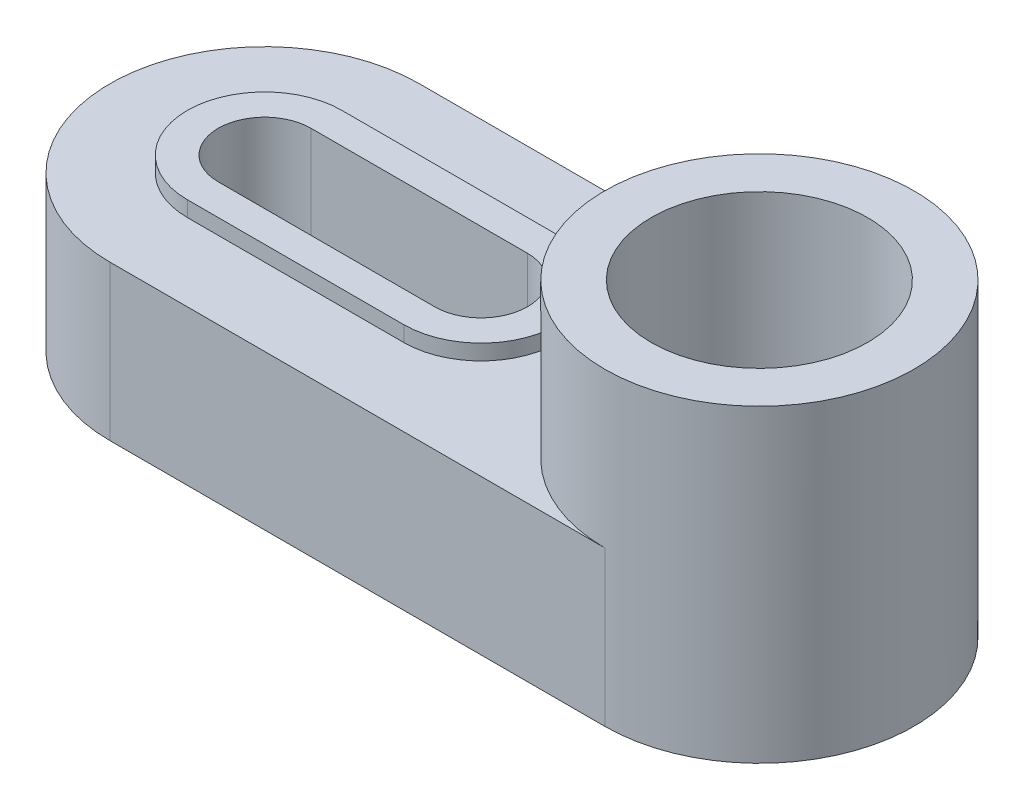
ISO-10303-21;
HEADER;
FILE_DESCRIPTION(('STEP AP214'),'2;1');
FILE_NAME('part.step','',(''),(''),'','','');
FILE_SCHEMA(('AUTOMOTIVE_DESIGN { 1 0 10303 214 1 1 1 1 }'));
ENDSEC;
DATA;
#1=APPLICATION_CONTEXT('core data for automotive mechanical design processes');
#2=APPLICATION_PROTOCOL_DEFINITION('international standard','automotive_design',2000,#1);
#3=PRODUCT_CONTEXT('',#1,'mechanical');
#4=PRODUCT('Part','Part','',(#3));
#5=PRODUCT_RELATED_PRODUCT_CATEGORY('part','',(#4));
#6=PRODUCT_DEFINITION_FORMATION('','',#4);
#7=PRODUCT_DEFINITION_CONTEXT('part definition',#1,'design');
#8=PRODUCT_DEFINITION('design','',#6,#7);
#9=PRODUCT_DEFINITION_SHAPE('','',#8);
#10=(LENGTH_UNIT() NAMED_UNIT(*) SI_UNIT(.MILLI.,.METRE.));
#11=(NAMED_UNIT(*) PLANE_ANGLE_UNIT() SI_UNIT($,.RADIAN.));
#12=(NAMED_UNIT(*) SI_UNIT($,.STERADIAN.) SOLID_ANGLE_UNIT());
#13=UNCERTAINTY_MEASURE_WITH_UNIT(LENGTH_MEASURE(1.E-05),#10,'distance_accuracy_value','');
#14=(GEOMETRIC_REPRESENTATION_CONTEXT(3) GLOBAL_UNCERTAINTY_ASSIGNED_CONTEXT((#13)) GLOBAL_UNIT_ASSIGNED_CONTEXT((#10,
#11,#12)) REPRESENTATION_CONTEXT('',''));
#15=CARTESIAN_POINT('',(0.,0.,0.));
#16=DIRECTION('',(0.,0.,1.));
#17=DIRECTION('',(1.,0.,0.));
#18=AXIS2_PLACEMENT_3D('',#15,#16,#17);
#19=CARTESIAN_POINT('',(0.,10.,-10.));
#20=DIRECTION('',(0.,0.,-1.));
#21=DIRECTION('',(-1.,0.,0.));
#22=AXIS2_PLACEMENT_3D('',#19,#20,#21);
#23=PLANE('',#22);
#24=DIRECTION('',(1.,0.,0.));
#25=VECTOR('',#24,1.);
#26=CARTESIAN_POINT('',(0.,0.,-10.));
#27=LINE('',#26,#25);
#28=CARTESIAN_POINT('',(-6.90376569037657,0.,-10.));
#29=VERTEX_POINT('',#28);
#30=CARTESIAN_POINT('',(25.0962343096234,0.,-10.));
#31=VERTEX_POINT('',#30);
#32=EDGE_CURVE('E173',#29,#31,#27,.T.);
#33=ORIENTED_EDGE('',*,*,#32,.F.);
#34=DIRECTION('',(0.,-1.,0.));
#35=VECTOR('',#34,1.);
#36=CARTESIAN_POINT('',(-6.90376569037657,10.,-10.));
#37=LINE('',#36,#35);
#38=CARTESIAN_POINT('',(-6.90376569037657,10.,-10.));
#39=VERTEX_POINT('',#38);
#40=EDGE_CURVE('E80',#39,#29,#37,.T.);
#41=ORIENTED_EDGE('',*,*,#40,.F.);
#42=DIRECTION('',(1.,0.,0.));
#43=VECTOR('',#42,1.);
#44=CARTESIAN_POINT('',(0.,10.,-10.));
#45=LINE('',#44,#43);
#46=CARTESIAN_POINT('',(25.0962343096234,10.,-10.));
#47=VERTEX_POINT('',#46);
#48=EDGE_CURVE('E181',#39,#47,#45,.T.);
#49=ORIENTED_EDGE('',*,*,#48,.T.);
#50=DIRECTION('',(0.,-1.,0.));
#51=VECTOR('',#50,1.);
#52=CARTESIAN_POINT('',(25.0962343096234,10.,-10.));
#53=LINE('',#52,#51);
#54=EDGE_CURVE('E12',#47,#31,#53,.T.);
#55=ORIENTED_EDGE('',*,*,#54,.T.);
#56=EDGE_LOOP('',(#33,#41,#49,#55));
#57=FACE_BOUND('',#56,.T.);
#58=ADVANCED_FACE('F71',(#57),#23,.T.);
#59=CARTESIAN_POINT('',(-6.90376569037657,10.,0.));
#60=DIRECTION('',(0.,-1.,0.));
#61=DIRECTION('',(0.,0.,-1.));
#62=AXIS2_PLACEMENT_3D('',#59,#60,#61);
#63=CYLINDRICAL_SURFACE('',#62,10.);
#64=CARTESIAN_POINT('',(-6.90376569037657,0.,0.));
#65=DIRECTION('',(0.,1.,0.));
#66=DIRECTION('',(0.,0.,1.));
#67=AXIS2_PLACEMENT_3D('',#64,#65,#66);
#68=CIRCLE('',#67,10.);
#69=CARTESIAN_POINT('',(-6.90376569037657,0.,10.));
#70=VERTEX_POINT('',#69);
#71=EDGE_CURVE('E102',#29,#70,#68,.T.);
#72=ORIENTED_EDGE('',*,*,#71,.T.);
#73=DIRECTION('',(0.,-1.,0.));
#74=VECTOR('',#73,1.);
#75=CARTESIAN_POINT('',(-6.90376569037657,10.,10.));
#76=LINE('',#75,#74);
#77=CARTESIAN_POINT('',(-6.90376569037657,10.,10.));
#78=VERTEX_POINT('',#77);
#79=EDGE_CURVE('E205',#78,#70,#76,.T.);
#80=ORIENTED_EDGE('',*,*,#79,.F.);
#81=CARTESIAN_POINT('',(-6.90376569037657,10.,0.));
#82=DIRECTION('',(0.,1.,0.));
#83=DIRECTION('',(0.,0.,1.));
#84=AXIS2_PLACEMENT_3D('',#81,#82,#83);
#85=CIRCLE('',#84,10.);
#86=EDGE_CURVE('E185',#39,#78,#85,.T.);
#87=ORIENTED_EDGE('',*,*,#86,.F.);
#88=ORIENTED_EDGE('',*,*,#40,.T.);
#89=EDGE_LOOP('',(#72,#80,#87,#88));
#90=FACE_BOUND('',#89,.T.);
#91=ADVANCED_FACE('F208',(#90),#63,.T.);
#92=CARTESIAN_POINT('',(0.,10.,10.));
#93=DIRECTION('',(0.,0.,-1.));
#94=DIRECTION('',(-1.,0.,0.));
#95=AXIS2_PLACEMENT_3D('',#92,#93,#94);
#96=PLANE('',#95);
#97=DIRECTION('',(1.,0.,0.));
#98=VECTOR('',#97,1.);
#99=CARTESIAN_POINT('',(0.,0.,10.));
#100=LINE('',#99,#98);
#101=CARTESIAN_POINT('',(25.0962343096234,0.,10.));
#102=VERTEX_POINT('',#101);
#103=EDGE_CURVE('E182',#70,#102,#100,.T.);
#104=ORIENTED_EDGE('',*,*,#103,.T.);
#105=DIRECTION('',(0.,-1.,0.));
#106=VECTOR('',#105,1.);
#107=CARTESIAN_POINT('',(25.0962343096234,10.,10.));
#108=LINE('',#107,#106);
#109=CARTESIAN_POINT('',(25.0962343096234,10.,10.));
#110=VERTEX_POINT('',#109);
#111=EDGE_CURVE('E195',#110,#102,#108,.T.);
#112=ORIENTED_EDGE('',*,*,#111,.F.);
#113=DIRECTION('',(1.,0.,0.));
#114=VECTOR('',#113,1.);
#115=CARTESIAN_POINT('',(0.,10.,10.));
#116=LINE('',#115,#114);
#117=EDGE_CURVE('E135',#78,#110,#116,.T.);
#118=ORIENTED_EDGE('',*,*,#117,.F.);
#119=ORIENTED_EDGE('',*,*,#79,.T.);
#120=EDGE_LOOP('',(#104,#112,#118,#119));
#121=FACE_BOUND('',#120,.T.);
#122=ADVANCED_FACE('F223',(#121),#96,.F.);
#123=CARTESIAN_POINT('',(0.,10.,0.));
#124=DIRECTION('',(0.,1.,0.));
#125=DIRECTION('',(0.,0.,1.));
#126=AXIS2_PLACEMENT_3D('',#123,#124,#125);
#127=PLANE('',#126);
#128=CARTESIAN_POINT('',(25.0962343096234,10.,0.));
#129=DIRECTION('',(0.,1.,0.));
#130=DIRECTION('',(0.,0.,1.));
#131=AXIS2_PLACEMENT_3D('',#128,#129,#130);
#132=CIRCLE('',#131,10.);
#133=EDGE_CURVE('E177',#47,#110,#132,.T.);
#134=ORIENTED_EDGE('',*,*,#133,.F.);
#135=ORIENTED_EDGE('',*,*,#48,.F.);
#136=ORIENTED_EDGE('',*,*,#86,.T.);
#137=ORIENTED_EDGE('',*,*,#117,.T.);
#138=EDGE_LOOP('',(#134,#135,#136,#137));
#139=FACE_BOUND('',#138,.T.);
#140=CARTESIAN_POINT('',(7.09623430962343,10.,0.));
#141=DIRECTION('',(0.,1.,0.));
#142=DIRECTION('',(0.,0.,1.));
#143=AXIS2_PLACEMENT_3D('',#140,#141,#142);
#144=CIRCLE('',#143,5.);
#145=CARTESIAN_POINT('',(7.09623430962343,10.,5.));
#146=VERTEX_POINT('',#145);
#147=CARTESIAN_POINT('',(7.09623430962343,10.,-5.));
#148=VERTEX_POINT('',#147);
#149=EDGE_CURVE('E124',#146,#148,#144,.T.);
#150=ORIENTED_EDGE('',*,*,#149,.F.);
#151=DIRECTION('',(1.,0.,0.));
#152=VECTOR('',#151,1.);
#153=CARTESIAN_POINT('',(0.,10.,5.));
#154=LINE('',#153,#152);
#155=CARTESIAN_POINT('',(-6.90376569037657,10.,5.));
#156=VERTEX_POINT('',#155);
#157=EDGE_CURVE('E128',#156,#146,#154,.T.);
#158=ORIENTED_EDGE('',*,*,#157,.F.);
#159=CARTESIAN_POINT('',(-6.90376569037657,10.,0.));
#160=DIRECTION('',(0.,1.,0.));
#161=DIRECTION('',(0.,0.,1.));
#162=AXIS2_PLACEMENT_3D('',#159,#160,#161);
#163=CIRCLE('',#162,5.);
#164=CARTESIAN_POINT('',(-6.90376569037657,10.,-5.));
#165=VERTEX_POINT('',#164);
#166=EDGE_CURVE('E147',#165,#156,#163,.T.);
#167=ORIENTED_EDGE('',*,*,#166,.F.);
#168=DIRECTION('',(1.,0.,0.));
#169=VECTOR('',#168,1.);
#170=CARTESIAN_POINT('',(0.,10.,-5.));
#171=LINE('',#170,#169);
#172=EDGE_CURVE('E88',#165,#148,#171,.T.);
#173=ORIENTED_EDGE('',*,*,#172,.T.);
#174=EDGE_LOOP('',(#150,#158,#167,#173));
#175=FACE_BOUND('',#174,.T.);
#176=ADVANCED_FACE('F126',(#139,#175),#127,.T.);
#177=CARTESIAN_POINT('',(0.,0.,0.));
#178=DIRECTION('',(0.,1.,0.));
#179=DIRECTION('',(0.,0.,1.));
#180=AXIS2_PLACEMENT_3D('',#177,#178,#179);
#181=PLANE('',#180);
#182=ORIENTED_EDGE('',*,*,#32,.T.);
#183=CARTESIAN_POINT('',(25.0962343096234,0.,0.));
#184=DIRECTION('',(0.,1.,0.));
#185=DIRECTION('',(0.,0.,1.));
#186=AXIS2_PLACEMENT_3D('',#183,#184,#185);
#187=CIRCLE('',#186,10.);
#188=EDGE_CURVE('E110',#102,#31,#187,.T.);
#189=ORIENTED_EDGE('',*,*,#188,.F.);
#190=ORIENTED_EDGE('',*,*,#103,.F.);
#191=ORIENTED_EDGE('',*,*,#71,.F.);
#192=EDGE_LOOP('',(#182,#189,#190,#191));
#193=FACE_BOUND('',#192,.T.);
#194=CARTESIAN_POINT('',(25.0962343096234,0.,0.));
#195=DIRECTION('',(0.,1.,0.));
#196=DIRECTION('',(0.,0.,1.));
#197=AXIS2_PLACEMENT_3D('',#194,#195,#196);
#198=CIRCLE('',#197,7.);
#199=CARTESIAN_POINT('',(25.0962343096234,0.,7.));
#200=VERTEX_POINT('',#199);
#201=EDGE_CURVE('E155',#200,#200,#198,.T.);
#202=ORIENTED_EDGE('',*,*,#201,.T.);
#203=EDGE_LOOP('',(#202));
#204=FACE_BOUND('',#203,.T.);
#205=CARTESIAN_POINT('',(-6.90376569037657,0.,0.));
#206=DIRECTION('',(0.,1.,0.));
#207=DIRECTION('',(0.,0.,1.));
#208=AXIS2_PLACEMENT_3D('',#205,#206,#207);
#209=CIRCLE('',#208,3.);
#210=CARTESIAN_POINT('',(-6.90376569037657,0.,-3.));
#211=VERTEX_POINT('',#210);
#212=CARTESIAN_POINT('',(-6.90376569037657,0.,3.));
#213=VERTEX_POINT('',#212);
#214=EDGE_CURVE('E417',#211,#213,#209,.T.);
#215=ORIENTED_EDGE('',*,*,#214,.T.);
#216=DIRECTION('',(1.,0.,0.));
#217=VECTOR('',#216,1.);
#218=CARTESIAN_POINT('',(-6.90376569037657,0.,3.));
#219=LINE('',#218,#217);
#220=CARTESIAN_POINT('',(7.09623430962343,0.,3.));
#221=VERTEX_POINT('',#220);
#222=EDGE_CURVE('E412',#213,#221,#219,.T.);
#223=ORIENTED_EDGE('',*,*,#222,.T.);
#224=CARTESIAN_POINT('',(7.09623430962343,0.,0.));
#225=DIRECTION('',(0.,1.,0.));
#226=DIRECTION('',(0.,0.,1.));
#227=AXIS2_PLACEMENT_3D('',#224,#225,#226);
#228=CIRCLE('',#227,3.);
#229=CARTESIAN_POINT('',(7.09623430962343,0.,-3.));
#230=VERTEX_POINT('',#229);
#231=EDGE_CURVE('E407',#221,#230,#228,.T.);
#232=ORIENTED_EDGE('',*,*,#231,.T.);
#233=DIRECTION('',(1.,0.,0.));
#234=VECTOR('',#233,1.);
#235=CARTESIAN_POINT('',(-6.90376569037657,0.,-3.));
#236=LINE('',#235,#234);
#237=EDGE_CURVE('E390',#211,#230,#236,.T.);
#238=ORIENTED_EDGE('',*,*,#237,.F.);
#239=EDGE_LOOP('',(#215,#223,#232,#238));
#240=FACE_BOUND('',#239,.T.);
#241=ADVANCED_FACE('F210',(#193,#204,#240),#181,.F.);
#242=CARTESIAN_POINT('',(25.0962343096234,20.,0.));
#243=DIRECTION('',(0.,-1.,0.));
#244=DIRECTION('',(0.,0.,-1.));
#245=AXIS2_PLACEMENT_3D('',#242,#243,#244);
#246=CYLINDRICAL_SURFACE('',#245,10.);
#247=CARTESIAN_POINT('',(25.0962343096234,20.,0.));
#248=DIRECTION('',(0.,1.,0.));
#249=DIRECTION('',(0.,0.,1.));
#250=AXIS2_PLACEMENT_3D('',#247,#248,#249);
#251=CIRCLE('',#250,10.);
#252=CARTESIAN_POINT('',(25.0962343096234,20.,10.));
#253=VERTEX_POINT('',#252);
#254=EDGE_CURVE('E170',#253,#253,#251,.T.);
#255=ORIENTED_EDGE('',*,*,#254,.F.);
#256=EDGE_LOOP('',(#255));
#257=FACE_BOUND('',#256,.T.);
#258=ORIENTED_EDGE('',*,*,#188,.T.);
#259=ORIENTED_EDGE('',*,*,#54,.F.);
#260=ORIENTED_EDGE('',*,*,#133,.T.);
#261=ORIENTED_EDGE('',*,*,#111,.T.);
#262=EDGE_LOOP('',(#258,#259,#260,#261));
#263=FACE_BOUND('',#262,.T.);
#264=ADVANCED_FACE('F218',(#257,#263),#246,.T.);
#265=CARTESIAN_POINT('',(25.0962343096234,20.,0.));
#266=DIRECTION('',(0.,-1.,0.));
#267=DIRECTION('',(0.,0.,-1.));
#268=AXIS2_PLACEMENT_3D('',#265,#266,#267);
#269=CYLINDRICAL_SURFACE('',#268,7.);
#270=CARTESIAN_POINT('',(25.0962343096234,20.,0.));
#271=DIRECTION('',(0.,1.,0.));
#272=DIRECTION('',(0.,0.,1.));
#273=AXIS2_PLACEMENT_3D('',#270,#271,#272);
#274=CIRCLE('',#273,7.);
#275=CARTESIAN_POINT('',(25.0962343096234,20.,7.));
#276=VERTEX_POINT('',#275);
#277=EDGE_CURVE('E166',#276,#276,#274,.T.);
#278=ORIENTED_EDGE('',*,*,#277,.T.);
#279=EDGE_LOOP('',(#278));
#280=FACE_BOUND('',#279,.T.);
#281=ORIENTED_EDGE('',*,*,#201,.F.);
#282=EDGE_LOOP('',(#281));
#283=FACE_BOUND('',#282,.T.);
#284=ADVANCED_FACE('F275',(#280,#283),#269,.F.);
#285=CARTESIAN_POINT('',(0.,20.,0.));
#286=DIRECTION('',(0.,1.,0.));
#287=DIRECTION('',(0.,0.,1.));
#288=AXIS2_PLACEMENT_3D('',#285,#286,#287);
#289=PLANE('',#288);
#290=ORIENTED_EDGE('',*,*,#277,.F.);
#291=EDGE_LOOP('',(#290));
#292=FACE_BOUND('',#291,.T.);
#293=ORIENTED_EDGE('',*,*,#254,.T.);
#294=EDGE_LOOP('',(#293));
#295=FACE_BOUND('',#294,.T.);
#296=ADVANCED_FACE('F287',(#292,#295),#289,.T.);
#297=CARTESIAN_POINT('',(7.09623430962343,11.,0.));
#298=DIRECTION('',(0.,1.,0.));
#299=DIRECTION('',(0.,0.,1.));
#300=AXIS2_PLACEMENT_3D('',#297,#298,#299);
#301=PLANE('',#300);
#302=DIRECTION('',(1.,0.,0.));
#303=VECTOR('',#302,1.);
#304=CARTESIAN_POINT('',(-6.90376569037657,11.,5.));
#305=LINE('',#304,#303);
#306=CARTESIAN_POINT('',(-6.90376569037657,11.,5.));
#307=VERTEX_POINT('',#306);
#308=CARTESIAN_POINT('',(7.09623430962343,11.,5.));
#309=VERTEX_POINT('',#308);
#310=EDGE_CURVE('E434',#307,#309,#305,.T.);
#311=ORIENTED_EDGE('',*,*,#310,.T.);
#312=CARTESIAN_POINT('',(7.09623430962343,11.,0.));
#313=DIRECTION('',(0.,1.,0.));
#314=DIRECTION('',(0.,0.,1.));
#315=AXIS2_PLACEMENT_3D('',#312,#313,#314);
#316=CIRCLE('',#315,5.);
#317=CARTESIAN_POINT('',(7.09623430962343,11.,-5.));
#318=VERTEX_POINT('',#317);
#319=EDGE_CURVE('E152',#309,#318,#316,.T.);
#320=ORIENTED_EDGE('',*,*,#319,.T.);
#321=DIRECTION('',(1.,0.,0.));
#322=VECTOR('',#321,1.);
#323=CARTESIAN_POINT('',(-6.90376569037657,11.,-5.));
#324=LINE('',#323,#322);
#325=CARTESIAN_POINT('',(-6.90376569037657,11.,-5.));
#326=VERTEX_POINT('',#325);
#327=EDGE_CURVE('E439',#326,#318,#324,.T.);
#328=ORIENTED_EDGE('',*,*,#327,.F.);
#329=CARTESIAN_POINT('',(-6.90376569037657,11.,0.));
#330=DIRECTION('',(0.,1.,0.));
#331=DIRECTION('',(0.,0.,1.));
#332=AXIS2_PLACEMENT_3D('',#329,#330,#331);
#333=CIRCLE('',#332,5.);
#334=EDGE_CURVE('E443',#326,#307,#333,.T.);
#335=ORIENTED_EDGE('',*,*,#334,.T.);
#336=EDGE_LOOP('',(#311,#320,#328,#335));
#337=FACE_BOUND('',#336,.T.);
#338=DIRECTION('',(1.,0.,0.));
#339=VECTOR('',#338,1.);
#340=CARTESIAN_POINT('',(-6.90376569037657,11.,3.));
#341=LINE('',#340,#339);
#342=CARTESIAN_POINT('',(-6.90376569037657,11.,3.));
#343=VERTEX_POINT('',#342);
#344=CARTESIAN_POINT('',(7.09623430962343,11.,3.));
#345=VERTEX_POINT('',#344);
#346=EDGE_CURVE('E476',#343,#345,#341,.T.);
#347=ORIENTED_EDGE('',*,*,#346,.F.);
#348=CARTESIAN_POINT('',(-6.90376569037657,11.,0.));
#349=DIRECTION('',(0.,1.,0.));
#350=DIRECTION('',(0.,0.,1.));
#351=AXIS2_PLACEMENT_3D('',#348,#349,#350);
#352=CIRCLE('',#351,3.);
#353=CARTESIAN_POINT('',(-6.90376569037657,11.,-3.));
#354=VERTEX_POINT('',#353);
#355=EDGE_CURVE('E406',#354,#343,#352,.T.);
#356=ORIENTED_EDGE('',*,*,#355,.F.);
#357=DIRECTION('',(1.,0.,0.));
#358=VECTOR('',#357,1.);
#359=CARTESIAN_POINT('',(-6.90376569037657,11.,-3.));
#360=LINE('',#359,#358);
#361=CARTESIAN_POINT('',(7.09623430962343,11.,-3.));
#362=VERTEX_POINT('',#361);
#363=EDGE_CURVE('E423',#354,#362,#360,.T.);
#364=ORIENTED_EDGE('',*,*,#363,.T.);
#365=CARTESIAN_POINT('',(7.09623430962343,11.,0.));
#366=DIRECTION('',(0.,1.,0.));
#367=DIRECTION('',(0.,0.,1.));
#368=AXIS2_PLACEMENT_3D('',#365,#366,#367);
#369=CIRCLE('',#368,3.);
#370=EDGE_CURVE('E473',#345,#362,#369,.T.);
#371=ORIENTED_EDGE('',*,*,#370,.F.);
#372=EDGE_LOOP('',(#347,#356,#364,#371));
#373=FACE_BOUND('',#372,.T.);
#374=ADVANCED_FACE('F295',(#337,#373),#301,.T.);
#375=CARTESIAN_POINT('',(-6.90376569037657,11.,5.));
#376=DIRECTION('',(0.,0.,-1.));
#377=DIRECTION('',(-1.,0.,0.));
#378=AXIS2_PLACEMENT_3D('',#375,#376,#377);
#379=PLANE('',#378);
#380=ORIENTED_EDGE('',*,*,#157,.T.);
#381=DIRECTION('',(0.,-1.,0.));
#382=VECTOR('',#381,1.);
#383=CARTESIAN_POINT('',(7.09623430962343,11.,5.));
#384=LINE('',#383,#382);
#385=EDGE_CURVE('E143',#309,#146,#384,.T.);
#386=ORIENTED_EDGE('',*,*,#385,.F.);
#387=ORIENTED_EDGE('',*,*,#310,.F.);
#388=DIRECTION('',(0.,-1.,0.));
#389=VECTOR('',#388,1.);
#390=CARTESIAN_POINT('',(-6.90376569037657,11.,5.));
#391=LINE('',#390,#389);
#392=EDGE_CURVE('E145',#307,#156,#391,.T.);
#393=ORIENTED_EDGE('',*,*,#392,.T.);
#394=EDGE_LOOP('',(#380,#386,#387,#393));
#395=FACE_BOUND('',#394,.T.);
#396=ADVANCED_FACE('F140',(#395),#379,.F.);
#397=CARTESIAN_POINT('',(7.09623430962343,11.,0.));
#398=DIRECTION('',(0.,-1.,0.));
#399=DIRECTION('',(0.,0.,-1.));
#400=AXIS2_PLACEMENT_3D('',#397,#398,#399);
#401=CYLINDRICAL_SURFACE('',#400,5.);
#402=ORIENTED_EDGE('',*,*,#149,.T.);
#403=DIRECTION('',(0.,-1.,0.));
#404=VECTOR('',#403,1.);
#405=CARTESIAN_POINT('',(7.09623430962343,11.,-5.));
#406=LINE('',#405,#404);
#407=EDGE_CURVE('E156',#318,#148,#406,.T.);
#408=ORIENTED_EDGE('',*,*,#407,.F.);
#409=ORIENTED_EDGE('',*,*,#319,.F.);
#410=ORIENTED_EDGE('',*,*,#385,.T.);
#411=EDGE_LOOP('',(#402,#408,#409,#410));
#412=FACE_BOUND('',#411,.T.);
#413=ADVANCED_FACE('F150',(#412),#401,.T.);
#414=CARTESIAN_POINT('',(-6.90376569037657,11.,-5.));
#415=DIRECTION('',(0.,0.,-1.));
#416=DIRECTION('',(-1.,0.,0.));
#417=AXIS2_PLACEMENT_3D('',#414,#415,#416);
#418=PLANE('',#417);
#419=ORIENTED_EDGE('',*,*,#407,.T.);
#420=ORIENTED_EDGE('',*,*,#172,.F.);
#421=DIRECTION('',(0.,-1.,0.));
#422=VECTOR('',#421,1.);
#423=CARTESIAN_POINT('',(-6.90376569037657,11.,-5.));
#424=LINE('',#423,#422);
#425=EDGE_CURVE('E162',#326,#165,#424,.T.);
#426=ORIENTED_EDGE('',*,*,#425,.F.);
#427=ORIENTED_EDGE('',*,*,#327,.T.);
#428=EDGE_LOOP('',(#419,#420,#426,#427));
#429=FACE_BOUND('',#428,.T.);
#430=ADVANCED_FACE('F319',(#429),#418,.T.);
#431=CARTESIAN_POINT('',(-6.90376569037657,11.,0.));
#432=DIRECTION('',(0.,-1.,0.));
#433=DIRECTION('',(0.,0.,-1.));
#434=AXIS2_PLACEMENT_3D('',#431,#432,#433);
#435=CYLINDRICAL_SURFACE('',#434,5.);
#436=ORIENTED_EDGE('',*,*,#166,.T.);
#437=ORIENTED_EDGE('',*,*,#392,.F.);
#438=ORIENTED_EDGE('',*,*,#334,.F.);
#439=ORIENTED_EDGE('',*,*,#425,.T.);
#440=EDGE_LOOP('',(#436,#437,#438,#439));
#441=FACE_BOUND('',#440,.T.);
#442=ADVANCED_FACE('F327',(#441),#435,.T.);
#443=CARTESIAN_POINT('',(-6.90376569037657,11.,0.));
#444=DIRECTION('',(0.,-1.,0.));
#445=DIRECTION('',(0.,0.,-1.));
#446=AXIS2_PLACEMENT_3D('',#443,#444,#445);
#447=CYLINDRICAL_SURFACE('',#446,3.);
#448=ORIENTED_EDGE('',*,*,#214,.F.);
#449=DIRECTION('',(0.,-1.,0.));
#450=VECTOR('',#449,1.);
#451=CARTESIAN_POINT('',(-6.90376569037657,11.,-3.));
#452=LINE('',#451,#450);
#453=EDGE_CURVE('E399',#354,#211,#452,.T.);
#454=ORIENTED_EDGE('',*,*,#453,.F.);
#455=ORIENTED_EDGE('',*,*,#355,.T.);
#456=DIRECTION('',(0.,-1.,0.));
#457=VECTOR('',#456,1.);
#458=CARTESIAN_POINT('',(-6.90376569037657,11.,3.));
#459=LINE('',#458,#457);
#460=EDGE_CURVE('E430',#343,#213,#459,.T.);
#461=ORIENTED_EDGE('',*,*,#460,.T.);
#462=EDGE_LOOP('',(#448,#454,#455,#461));
#463=FACE_BOUND('',#462,.T.);
#464=ADVANCED_FACE('F336',(#463),#447,.F.);
#465=CARTESIAN_POINT('',(-6.90376569037657,11.,3.));
#466=DIRECTION('',(0.,0.,-1.));
#467=DIRECTION('',(-1.,0.,0.));
#468=AXIS2_PLACEMENT_3D('',#465,#466,#467);
#469=PLANE('',#468);
#470=ORIENTED_EDGE('',*,*,#222,.F.);
#471=ORIENTED_EDGE('',*,*,#460,.F.);
#472=ORIENTED_EDGE('',*,*,#346,.T.);
#473=DIRECTION('',(0.,-1.,0.));
#474=VECTOR('',#473,1.);
#475=CARTESIAN_POINT('',(7.09623430962343,11.,3.));
#476=LINE('',#475,#474);
#477=EDGE_CURVE('E426',#345,#221,#476,.T.);
#478=ORIENTED_EDGE('',*,*,#477,.T.);
#479=EDGE_LOOP('',(#470,#471,#472,#478));
#480=FACE_BOUND('',#479,.T.);
#481=ADVANCED_FACE('F345',(#480),#469,.T.);
#482=CARTESIAN_POINT('',(7.09623430962343,11.,0.));
#483=DIRECTION('',(0.,-1.,0.));
#484=DIRECTION('',(0.,0.,-1.));
#485=AXIS2_PLACEMENT_3D('',#482,#483,#484);
#486=CYLINDRICAL_SURFACE('',#485,3.);
#487=ORIENTED_EDGE('',*,*,#231,.F.);
#488=ORIENTED_EDGE('',*,*,#477,.F.);
#489=ORIENTED_EDGE('',*,*,#370,.T.);
#490=DIRECTION('',(0.,-1.,0.));
#491=VECTOR('',#490,1.);
#492=CARTESIAN_POINT('',(7.09623430962343,11.,-3.));
#493=LINE('',#492,#491);
#494=EDGE_CURVE('E395',#362,#230,#493,.T.);
#495=ORIENTED_EDGE('',*,*,#494,.T.);
#496=EDGE_LOOP('',(#487,#488,#489,#495));
#497=FACE_BOUND('',#496,.T.);
#498=ADVANCED_FACE('F354',(#497),#486,.F.);
#499=CARTESIAN_POINT('',(-6.90376569037657,11.,-3.));
#500=DIRECTION('',(0.,0.,-1.));
#501=DIRECTION('',(-1.,0.,0.));
#502=AXIS2_PLACEMENT_3D('',#499,#500,#501);
#503=PLANE('',#502);
#504=ORIENTED_EDGE('',*,*,#237,.T.);
#505=ORIENTED_EDGE('',*,*,#494,.F.);
#506=ORIENTED_EDGE('',*,*,#363,.F.);
#507=ORIENTED_EDGE('',*,*,#453,.T.);
#508=EDGE_LOOP('',(#504,#505,#506,#507));
#509=FACE_BOUND('',#508,.T.);
#510=ADVANCED_FACE('F363',(#509),#503,.F.);
#511=CLOSED_SHELL('',(#58,#91,#122,#176,#241,#264,#284,#296,#374,#396,#413,#430,#442,#464,#481,
#498,#510));
#512=MANIFOLD_SOLID_BREP('B2',#511);
#513=ADVANCED_BREP_SHAPE_REPRESENTATION('',(#18,#512),#14);
#514=SHAPE_DEFINITION_REPRESENTATION(#9,#513);
ENDSEC;
END-ISO-10303-21;
